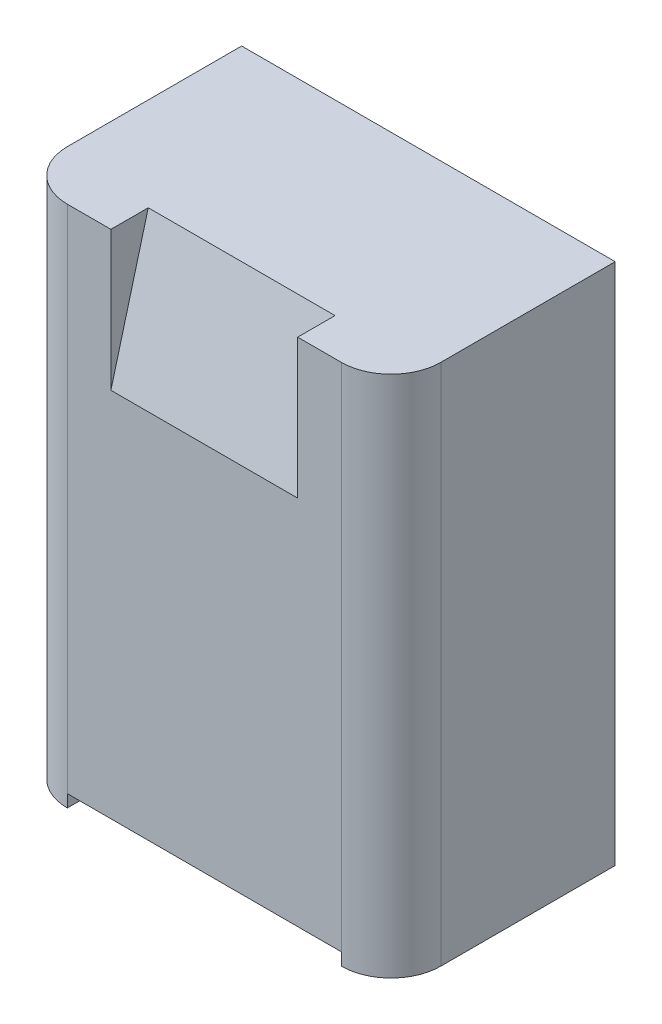
ISO-10303-21;
HEADER;
FILE_DESCRIPTION(('STEP AP214'),'2;1');
FILE_NAME('part.step','',(''),(''),'','','');
FILE_SCHEMA(('AUTOMOTIVE_DESIGN { 1 0 10303 214 1 1 1 1 }'));
ENDSEC;
DATA;
#1=APPLICATION_CONTEXT('core data for automotive mechanical design processes');
#2=APPLICATION_PROTOCOL_DEFINITION('international standard','automotive_design',2000,#1);
#3=PRODUCT_CONTEXT('',#1,'mechanical');
#4=PRODUCT('Part','Part','',(#3));
#5=PRODUCT_RELATED_PRODUCT_CATEGORY('part','',(#4));
#6=PRODUCT_DEFINITION_FORMATION('','',#4);
#7=PRODUCT_DEFINITION_CONTEXT('part definition',#1,'design');
#8=PRODUCT_DEFINITION('design','',#6,#7);
#9=PRODUCT_DEFINITION_SHAPE('','',#8);
#10=(LENGTH_UNIT() NAMED_UNIT(*) SI_UNIT(.MILLI.,.METRE.));
#11=(NAMED_UNIT(*) PLANE_ANGLE_UNIT() SI_UNIT($,.RADIAN.));
#12=(NAMED_UNIT(*) SI_UNIT($,.STERADIAN.) SOLID_ANGLE_UNIT());
#13=UNCERTAINTY_MEASURE_WITH_UNIT(LENGTH_MEASURE(1.E-05),#10,'distance_accuracy_value','');
#14=(GEOMETRIC_REPRESENTATION_CONTEXT(3) GLOBAL_UNCERTAINTY_ASSIGNED_CONTEXT((#13)) GLOBAL_UNIT_ASSIGNED_CONTEXT((#10,
#11,#12)) REPRESENTATION_CONTEXT('',''));
#15=CARTESIAN_POINT('',(0.,0.,0.));
#16=DIRECTION('',(0.,0.,1.));
#17=DIRECTION('',(1.,0.,0.));
#18=AXIS2_PLACEMENT_3D('',#15,#16,#17);
#19=CARTESIAN_POINT('',(-381.,1066.8,228.6));
#20=DIRECTION('',(0.,-1.,0.));
#21=DIRECTION('',(0.,0.,-1.));
#22=AXIS2_PLACEMENT_3D('',#19,#20,#21);
#23=PLANE('',#22);
#24=DIRECTION('',(0.,0.,1.));
#25=VECTOR('',#24,1.);
#26=CARTESIAN_POINT('',(-190.5,1066.8,228.6));
#27=LINE('',#26,#25);
#28=CARTESIAN_POINT('',(-190.5,1066.8,152.4));
#29=VERTEX_POINT('',#28);
#30=CARTESIAN_POINT('',(-190.5,1066.8,228.6));
#31=VERTEX_POINT('',#30);
#32=EDGE_CURVE('E119',#29,#31,#27,.T.);
#33=ORIENTED_EDGE('',*,*,#32,.F.);
#34=DIRECTION('',(1.,0.,0.));
#35=VECTOR('',#34,1.);
#36=CARTESIAN_POINT('',(-190.5,1066.8,152.4));
#37=LINE('',#36,#35);
#38=CARTESIAN_POINT('',(190.5,1066.8,152.4));
#39=VERTEX_POINT('',#38);
#40=EDGE_CURVE('E208',#29,#39,#37,.T.);
#41=ORIENTED_EDGE('',*,*,#40,.T.);
#42=DIRECTION('',(0.,0.,1.));
#43=VECTOR('',#42,1.);
#44=CARTESIAN_POINT('',(190.5,1066.8,228.6));
#45=LINE('',#44,#43);
#46=CARTESIAN_POINT('',(190.5,1066.8,228.6));
#47=VERTEX_POINT('',#46);
#48=EDGE_CURVE('E227',#39,#47,#45,.T.);
#49=ORIENTED_EDGE('',*,*,#48,.T.);
#50=DIRECTION('',(-1.,0.,0.));
#51=VECTOR('',#50,1.);
#52=CARTESIAN_POINT('',(-381.,1066.8,228.6));
#53=LINE('',#52,#51);
#54=CARTESIAN_POINT('',(279.4,1066.8,228.6));
#55=VERTEX_POINT('',#54);
#56=EDGE_CURVE('E142',#55,#47,#53,.T.);
#57=ORIENTED_EDGE('',*,*,#56,.F.);
#58=CARTESIAN_POINT('',(279.4,1066.8,127.));
#59=DIRECTION('',(0.,-1.,0.));
#60=DIRECTION('',(0.,0.,-1.));
#61=AXIS2_PLACEMENT_3D('',#58,#59,#60);
#62=CIRCLE('',#61,101.6);
#63=CARTESIAN_POINT('',(381.,1066.8,127.));
#64=VERTEX_POINT('',#63);
#65=EDGE_CURVE('E179',#55,#64,#62,.F.);
#66=ORIENTED_EDGE('',*,*,#65,.T.);
#67=DIRECTION('',(0.,0.,-1.));
#68=VECTOR('',#67,1.);
#69=CARTESIAN_POINT('',(381.,1066.8,228.6));
#70=LINE('',#69,#68);
#71=CARTESIAN_POINT('',(381.,1066.8,-228.6));
#72=VERTEX_POINT('',#71);
#73=EDGE_CURVE('E165',#64,#72,#70,.T.);
#74=ORIENTED_EDGE('',*,*,#73,.T.);
#75=DIRECTION('',(-1.,0.,0.));
#76=VECTOR('',#75,1.);
#77=CARTESIAN_POINT('',(-381.,1066.8,-228.6));
#78=LINE('',#77,#76);
#79=CARTESIAN_POINT('',(-381.,1066.8,-228.6));
#80=VERTEX_POINT('',#79);
#81=EDGE_CURVE('E143',#72,#80,#78,.T.);
#82=ORIENTED_EDGE('',*,*,#81,.T.);
#83=DIRECTION('',(0.,0.,-1.));
#84=VECTOR('',#83,1.);
#85=CARTESIAN_POINT('',(-381.,1066.8,228.6));
#86=LINE('',#85,#84);
#87=CARTESIAN_POINT('',(-381.,1066.8,127.));
#88=VERTEX_POINT('',#87);
#89=EDGE_CURVE('E146',#88,#80,#86,.T.);
#90=ORIENTED_EDGE('',*,*,#89,.F.);
#91=CARTESIAN_POINT('',(-279.4,1066.8,127.));
#92=DIRECTION('',(0.,-1.,0.));
#93=DIRECTION('',(0.,0.,-1.));
#94=AXIS2_PLACEMENT_3D('',#91,#92,#93);
#95=CIRCLE('',#94,101.6);
#96=CARTESIAN_POINT('',(-279.4,1066.8,228.6));
#97=VERTEX_POINT('',#96);
#98=EDGE_CURVE('E140',#88,#97,#95,.F.);
#99=ORIENTED_EDGE('',*,*,#98,.T.);
#100=EDGE_CURVE('E133',#31,#97,#53,.T.);
#101=ORIENTED_EDGE('',*,*,#100,.F.);
#102=EDGE_LOOP('',(#33,#41,#49,#57,#66,#74,#82,#90,#99,#101));
#103=FACE_BOUND('',#102,.T.);
#104=ADVANCED_FACE('F31',(#103),#23,.F.);
#105=CARTESIAN_POINT('',(-381.,1066.8,228.6));
#106=DIRECTION('',(0.,0.,-1.));
#107=DIRECTION('',(-1.,0.,0.));
#108=AXIS2_PLACEMENT_3D('',#105,#106,#107);
#109=PLANE('',#108);
#110=DIRECTION('',(0.,-1.,0.));
#111=VECTOR('',#110,1.);
#112=CARTESIAN_POINT('',(-190.5,782.417728463244,228.6));
#113=LINE('',#112,#111);
#114=CARTESIAN_POINT('',(-190.5,782.417728463244,228.6));
#115=VERTEX_POINT('',#114);
#116=EDGE_CURVE('E122',#31,#115,#113,.T.);
#117=ORIENTED_EDGE('',*,*,#116,.F.);
#118=ORIENTED_EDGE('',*,*,#100,.T.);
#119=DIRECTION('',(0.,-1.,0.));
#120=VECTOR('',#119,1.);
#121=CARTESIAN_POINT('',(-279.4,1066.8,228.6));
#122=LINE('',#121,#120);
#123=CARTESIAN_POINT('',(-279.4,25.4000000000001,228.6));
#124=VERTEX_POINT('',#123);
#125=EDGE_CURVE('E172',#97,#124,#122,.T.);
#126=ORIENTED_EDGE('',*,*,#125,.T.);
#127=DIRECTION('',(-1.,0.,0.));
#128=VECTOR('',#127,1.);
#129=CARTESIAN_POINT('',(-279.4,25.4,228.6));
#130=LINE('',#129,#128);
#131=CARTESIAN_POINT('',(279.4,25.4,228.6));
#132=VERTEX_POINT('',#131);
#133=EDGE_CURVE('E54',#132,#124,#130,.T.);
#134=ORIENTED_EDGE('',*,*,#133,.F.);
#135=DIRECTION('',(0.,1.,0.));
#136=VECTOR('',#135,1.);
#137=CARTESIAN_POINT('',(279.4,1066.8,228.6));
#138=LINE('',#137,#136);
#139=EDGE_CURVE('E174',#132,#55,#138,.T.);
#140=ORIENTED_EDGE('',*,*,#139,.T.);
#141=ORIENTED_EDGE('',*,*,#56,.T.);
#142=DIRECTION('',(0.,-1.,0.));
#143=VECTOR('',#142,1.);
#144=CARTESIAN_POINT('',(190.5,782.417728463244,228.6));
#145=LINE('',#144,#143);
#146=CARTESIAN_POINT('',(190.5,782.417728463244,228.6));
#147=VERTEX_POINT('',#146);
#148=EDGE_CURVE('E225',#47,#147,#145,.T.);
#149=ORIENTED_EDGE('',*,*,#148,.T.);
#150=DIRECTION('',(1.,0.,0.));
#151=VECTOR('',#150,1.);
#152=CARTESIAN_POINT('',(-190.5,782.417728463244,228.6));
#153=LINE('',#152,#151);
#154=EDGE_CURVE('E136',#115,#147,#153,.T.);
#155=ORIENTED_EDGE('',*,*,#154,.F.);
#156=EDGE_LOOP('',(#117,#118,#126,#134,#140,#141,#149,#155));
#157=FACE_BOUND('',#156,.T.);
#158=ADVANCED_FACE('F131',(#157),#109,.F.);
#159=CARTESIAN_POINT('',(-381.,0.,228.6));
#160=DIRECTION('',(0.,1.,0.));
#161=DIRECTION('',(0.,0.,1.));
#162=AXIS2_PLACEMENT_3D('',#159,#160,#161);
#163=PLANE('',#162);
#164=DIRECTION('',(1.,0.,0.));
#165=VECTOR('',#164,1.);
#166=CARTESIAN_POINT('',(-381.,0.,-228.6));
#167=LINE('',#166,#165);
#168=CARTESIAN_POINT('',(-381.,0.,-228.6));
#169=VERTEX_POINT('',#168);
#170=CARTESIAN_POINT('',(-279.4,0.,-228.6));
#171=VERTEX_POINT('',#170);
#172=EDGE_CURVE('E159',#169,#171,#167,.T.);
#173=ORIENTED_EDGE('',*,*,#172,.T.);
#174=DIRECTION('',(0.,0.,1.));
#175=VECTOR('',#174,1.);
#176=CARTESIAN_POINT('',(-279.4,0.,-228.6));
#177=LINE('',#176,#175);
#178=CARTESIAN_POINT('',(-279.4,0.,228.6));
#179=VERTEX_POINT('',#178);
#180=EDGE_CURVE('E152',#171,#179,#177,.T.);
#181=ORIENTED_EDGE('',*,*,#180,.T.);
#182=CARTESIAN_POINT('',(-279.4,0.,127.));
#183=DIRECTION('',(0.,1.,0.));
#184=DIRECTION('',(0.,0.,1.));
#185=AXIS2_PLACEMENT_3D('',#182,#183,#184);
#186=CIRCLE('',#185,101.6);
#187=CARTESIAN_POINT('',(-381.,0.,127.));
#188=VERTEX_POINT('',#187);
#189=EDGE_CURVE('E183',#179,#188,#186,.F.);
#190=ORIENTED_EDGE('',*,*,#189,.T.);
#191=DIRECTION('',(0.,0.,-1.));
#192=VECTOR('',#191,1.);
#193=CARTESIAN_POINT('',(-381.,0.,228.6));
#194=LINE('',#193,#192);
#195=EDGE_CURVE('E170',#188,#169,#194,.T.);
#196=ORIENTED_EDGE('',*,*,#195,.T.);
#197=EDGE_LOOP('',(#173,#181,#190,#196));
#198=FACE_BOUND('',#197,.T.);
#199=ADVANCED_FACE('F245',(#198),#163,.F.);
#200=CARTESIAN_POINT('',(-381.,0.,228.6));
#201=DIRECTION('',(1.,0.,0.));
#202=DIRECTION('',(0.,0.,-1.));
#203=AXIS2_PLACEMENT_3D('',#200,#201,#202);
#204=PLANE('',#203);
#205=ORIENTED_EDGE('',*,*,#195,.F.);
#206=DIRECTION('',(0.,-1.,0.));
#207=VECTOR('',#206,1.);
#208=CARTESIAN_POINT('',(-381.,0.,127.));
#209=LINE('',#208,#207);
#210=EDGE_CURVE('E11',#188,#88,#209,.F.);
#211=ORIENTED_EDGE('',*,*,#210,.T.);
#212=ORIENTED_EDGE('',*,*,#89,.T.);
#213=DIRECTION('',(0.,-1.,0.));
#214=VECTOR('',#213,1.);
#215=CARTESIAN_POINT('',(-381.,0.,-228.6));
#216=LINE('',#215,#214);
#217=EDGE_CURVE('E154',#80,#169,#216,.T.);
#218=ORIENTED_EDGE('',*,*,#217,.T.);
#219=EDGE_LOOP('',(#205,#211,#212,#218));
#220=FACE_BOUND('',#219,.T.);
#221=ADVANCED_FACE('F256',(#220),#204,.F.);
#222=CARTESIAN_POINT('',(279.4,0.,127.));
#223=DIRECTION('',(0.,1.,0.));
#224=DIRECTION('',(0.,0.,1.));
#225=AXIS2_PLACEMENT_3D('',#222,#223,#224);
#226=CIRCLE('',#225,101.6);
#227=CARTESIAN_POINT('',(381.,0.,127.));
#228=VERTEX_POINT('',#227);
#229=CARTESIAN_POINT('',(279.4,0.,228.6));
#230=VERTEX_POINT('',#229);
#231=EDGE_CURVE('E39',#228,#230,#226,.F.);
#232=ORIENTED_EDGE('',*,*,#231,.T.);
#233=DIRECTION('',(0.,0.,1.));
#234=VECTOR('',#233,1.);
#235=CARTESIAN_POINT('',(279.4,0.,-228.6));
#236=LINE('',#235,#234);
#237=CARTESIAN_POINT('',(279.4,0.,-228.6));
#238=VERTEX_POINT('',#237);
#239=EDGE_CURVE('E191',#238,#230,#236,.T.);
#240=ORIENTED_EDGE('',*,*,#239,.F.);
#241=CARTESIAN_POINT('',(381.,0.,-228.6));
#242=VERTEX_POINT('',#241);
#243=EDGE_CURVE('E157',#238,#242,#167,.T.);
#244=ORIENTED_EDGE('',*,*,#243,.T.);
#245=DIRECTION('',(0.,0.,-1.));
#246=VECTOR('',#245,1.);
#247=CARTESIAN_POINT('',(381.,0.,228.6));
#248=LINE('',#247,#246);
#249=EDGE_CURVE('E167',#228,#242,#248,.T.);
#250=ORIENTED_EDGE('',*,*,#249,.F.);
#251=EDGE_LOOP('',(#232,#240,#244,#250));
#252=FACE_BOUND('',#251,.T.);
#253=ADVANCED_FACE('F190',(#252),#163,.F.);
#254=CARTESIAN_POINT('',(381.,0.,228.6));
#255=DIRECTION('',(-1.,0.,0.));
#256=DIRECTION('',(0.,0.,1.));
#257=AXIS2_PLACEMENT_3D('',#254,#255,#256);
#258=PLANE('',#257);
#259=ORIENTED_EDGE('',*,*,#73,.F.);
#260=DIRECTION('',(0.,1.,0.));
#261=VECTOR('',#260,1.);
#262=CARTESIAN_POINT('',(381.,0.,127.));
#263=LINE('',#262,#261);
#264=EDGE_CURVE('E181',#64,#228,#263,.F.);
#265=ORIENTED_EDGE('',*,*,#264,.T.);
#266=ORIENTED_EDGE('',*,*,#249,.T.);
#267=DIRECTION('',(0.,1.,0.));
#268=VECTOR('',#267,1.);
#269=CARTESIAN_POINT('',(381.,0.,-228.6));
#270=LINE('',#269,#268);
#271=EDGE_CURVE('E148',#242,#72,#270,.T.);
#272=ORIENTED_EDGE('',*,*,#271,.T.);
#273=EDGE_LOOP('',(#259,#265,#266,#272));
#274=FACE_BOUND('',#273,.T.);
#275=ADVANCED_FACE('F250',(#274),#258,.F.);
#276=CARTESIAN_POINT('',(-381.,1066.8,-228.6));
#277=DIRECTION('',(0.,0.,-1.));
#278=DIRECTION('',(-1.,0.,0.));
#279=AXIS2_PLACEMENT_3D('',#276,#277,#278);
#280=PLANE('',#279);
#281=DIRECTION('',(0.,-1.,0.));
#282=VECTOR('',#281,1.);
#283=CARTESIAN_POINT('',(-279.4,0.,-228.6));
#284=LINE('',#283,#282);
#285=CARTESIAN_POINT('',(-279.4,25.4,-228.6));
#286=VERTEX_POINT('',#285);
#287=EDGE_CURVE('E202',#286,#171,#284,.T.);
#288=ORIENTED_EDGE('',*,*,#287,.T.);
#289=ORIENTED_EDGE('',*,*,#172,.F.);
#290=ORIENTED_EDGE('',*,*,#217,.F.);
#291=ORIENTED_EDGE('',*,*,#81,.F.);
#292=ORIENTED_EDGE('',*,*,#271,.F.);
#293=ORIENTED_EDGE('',*,*,#243,.F.);
#294=DIRECTION('',(0.,1.,0.));
#295=VECTOR('',#294,1.);
#296=CARTESIAN_POINT('',(279.4,0.,-228.6));
#297=LINE('',#296,#295);
#298=CARTESIAN_POINT('',(279.4,25.4,-228.6));
#299=VERTEX_POINT('',#298);
#300=EDGE_CURVE('E206',#238,#299,#297,.T.);
#301=ORIENTED_EDGE('',*,*,#300,.T.);
#302=DIRECTION('',(-1.,0.,0.));
#303=VECTOR('',#302,1.);
#304=CARTESIAN_POINT('',(-279.4,25.4,-228.6));
#305=LINE('',#304,#303);
#306=EDGE_CURVE('E214',#299,#286,#305,.T.);
#307=ORIENTED_EDGE('',*,*,#306,.T.);
#308=EDGE_LOOP('',(#288,#289,#290,#291,#292,#293,#301,#307));
#309=FACE_BOUND('',#308,.T.);
#310=ADVANCED_FACE('F249',(#309),#280,.T.);
#311=CARTESIAN_POINT('',(279.4,1066.8,127.));
#312=DIRECTION('',(0.,1.,0.));
#313=DIRECTION('',(0.,0.,1.));
#314=AXIS2_PLACEMENT_3D('',#311,#312,#313);
#315=CYLINDRICAL_SURFACE('',#314,101.6);
#316=ORIENTED_EDGE('',*,*,#231,.F.);
#317=ORIENTED_EDGE('',*,*,#264,.F.);
#318=ORIENTED_EDGE('',*,*,#65,.F.);
#319=ORIENTED_EDGE('',*,*,#139,.F.);
#320=EDGE_CURVE('E175',#230,#132,#138,.T.);
#321=ORIENTED_EDGE('',*,*,#320,.F.);
#322=EDGE_LOOP('',(#316,#317,#318,#319,#321));
#323=FACE_BOUND('',#322,.T.);
#324=ADVANCED_FACE('F196',(#323),#315,.T.);
#325=CARTESIAN_POINT('',(-279.4,1066.8,127.));
#326=DIRECTION('',(0.,-1.,0.));
#327=DIRECTION('',(0.,0.,-1.));
#328=AXIS2_PLACEMENT_3D('',#325,#326,#327);
#329=CYLINDRICAL_SURFACE('',#328,101.6);
#330=ORIENTED_EDGE('',*,*,#98,.F.);
#331=ORIENTED_EDGE('',*,*,#210,.F.);
#332=ORIENTED_EDGE('',*,*,#189,.F.);
#333=DIRECTION('',(0.,-1.,0.));
#334=VECTOR('',#333,1.);
#335=CARTESIAN_POINT('',(-279.4,0.,228.6));
#336=LINE('',#335,#334);
#337=EDGE_CURVE('E203',#124,#179,#336,.T.);
#338=ORIENTED_EDGE('',*,*,#337,.F.);
#339=ORIENTED_EDGE('',*,*,#125,.F.);
#340=EDGE_LOOP('',(#330,#331,#332,#338,#339));
#341=FACE_BOUND('',#340,.T.);
#342=ADVANCED_FACE('F33',(#341),#329,.T.);
#343=CARTESIAN_POINT('',(-279.4,0.,-228.6));
#344=DIRECTION('',(-1.,0.,0.));
#345=DIRECTION('',(0.,0.,1.));
#346=AXIS2_PLACEMENT_3D('',#343,#344,#345);
#347=PLANE('',#346);
#348=ORIENTED_EDGE('',*,*,#337,.T.);
#349=ORIENTED_EDGE('',*,*,#180,.F.);
#350=ORIENTED_EDGE('',*,*,#287,.F.);
#351=DIRECTION('',(0.,0.,1.));
#352=VECTOR('',#351,1.);
#353=CARTESIAN_POINT('',(-279.4,25.4,-228.6));
#354=LINE('',#353,#352);
#355=EDGE_CURVE('E158',#286,#124,#354,.T.);
#356=ORIENTED_EDGE('',*,*,#355,.T.);
#357=EDGE_LOOP('',(#348,#349,#350,#356));
#358=FACE_BOUND('',#357,.T.);
#359=ADVANCED_FACE('F264',(#358),#347,.F.);
#360=CARTESIAN_POINT('',(-279.4,25.4,-228.6));
#361=DIRECTION('',(0.,1.,0.));
#362=DIRECTION('',(0.,0.,1.));
#363=AXIS2_PLACEMENT_3D('',#360,#361,#362);
#364=PLANE('',#363);
#365=ORIENTED_EDGE('',*,*,#133,.T.);
#366=ORIENTED_EDGE('',*,*,#355,.F.);
#367=ORIENTED_EDGE('',*,*,#306,.F.);
#368=DIRECTION('',(0.,0.,1.));
#369=VECTOR('',#368,1.);
#370=CARTESIAN_POINT('',(279.4,25.4,-228.6));
#371=LINE('',#370,#369);
#372=EDGE_CURVE('E200',#299,#132,#371,.T.);
#373=ORIENTED_EDGE('',*,*,#372,.T.);
#374=EDGE_LOOP('',(#365,#366,#367,#373));
#375=FACE_BOUND('',#374,.T.);
#376=ADVANCED_FACE('F275',(#375),#364,.F.);
#377=CARTESIAN_POINT('',(279.4,0.,-228.6));
#378=DIRECTION('',(1.,0.,0.));
#379=DIRECTION('',(0.,0.,-1.));
#380=AXIS2_PLACEMENT_3D('',#377,#378,#379);
#381=PLANE('',#380);
#382=ORIENTED_EDGE('',*,*,#320,.T.);
#383=ORIENTED_EDGE('',*,*,#372,.F.);
#384=ORIENTED_EDGE('',*,*,#300,.F.);
#385=ORIENTED_EDGE('',*,*,#239,.T.);
#386=EDGE_LOOP('',(#382,#383,#384,#385));
#387=FACE_BOUND('',#386,.T.);
#388=ADVANCED_FACE('F199',(#387),#381,.F.);
#389=CARTESIAN_POINT('',(-190.5,1066.8,152.4));
#390=DIRECTION('',(0.,-0.258819045102514,-0.96592582628907));
#391=DIRECTION('',(0.,0.96592582628907,-0.258819045102514));
#392=AXIS2_PLACEMENT_3D('',#389,#390,#391);
#393=PLANE('',#392);
#394=DIRECTION('',(0.,0.96592582628907,-0.258819045102514));
#395=VECTOR('',#394,1.);
#396=CARTESIAN_POINT('',(190.5,1066.8,152.4));
#397=LINE('',#396,#395);
#398=EDGE_CURVE('E46',#147,#39,#397,.T.);
#399=ORIENTED_EDGE('',*,*,#398,.T.);
#400=ORIENTED_EDGE('',*,*,#40,.F.);
#401=DIRECTION('',(0.,0.96592582628907,-0.258819045102514));
#402=VECTOR('',#401,1.);
#403=CARTESIAN_POINT('',(-190.5,1066.8,152.4));
#404=LINE('',#403,#402);
#405=EDGE_CURVE('E124',#115,#29,#404,.T.);
#406=ORIENTED_EDGE('',*,*,#405,.F.);
#407=ORIENTED_EDGE('',*,*,#154,.T.);
#408=EDGE_LOOP('',(#399,#400,#406,#407));
#409=FACE_BOUND('',#408,.T.);
#410=ADVANCED_FACE('F237',(#409),#393,.F.);
#411=CARTESIAN_POINT('',(-190.5,1066.8,228.6));
#412=DIRECTION('',(1.,0.,0.));
#413=DIRECTION('',(0.,0.,-1.));
#414=AXIS2_PLACEMENT_3D('',#411,#412,#413);
#415=PLANE('',#414);
#416=ORIENTED_EDGE('',*,*,#32,.T.);
#417=ORIENTED_EDGE('',*,*,#116,.T.);
#418=ORIENTED_EDGE('',*,*,#405,.T.);
#419=EDGE_LOOP('',(#416,#417,#418));
#420=FACE_BOUND('',#419,.T.);
#421=ADVANCED_FACE('F121',(#420),#415,.T.);
#422=CARTESIAN_POINT('',(190.5,1066.8,228.6));
#423=DIRECTION('',(1.,0.,0.));
#424=DIRECTION('',(0.,0.,-1.));
#425=AXIS2_PLACEMENT_3D('',#422,#423,#424);
#426=PLANE('',#425);
#427=ORIENTED_EDGE('',*,*,#48,.F.);
#428=ORIENTED_EDGE('',*,*,#398,.F.);
#429=ORIENTED_EDGE('',*,*,#148,.F.);
#430=EDGE_LOOP('',(#427,#428,#429));
#431=FACE_BOUND('',#430,.T.);
#432=ADVANCED_FACE('F231',(#431),#426,.F.);
#433=CLOSED_SHELL('',(#104,#158,#199,#221,#253,#275,#310,#324,#342,#359,#376,#388,#410,#421,#432));
#434=MANIFOLD_SOLID_BREP('B2',#433);
#435=ADVANCED_BREP_SHAPE_REPRESENTATION('',(#18,#434),#14);
#436=SHAPE_DEFINITION_REPRESENTATION(#9,#435);
ENDSEC;
END-ISO-10303-21;
